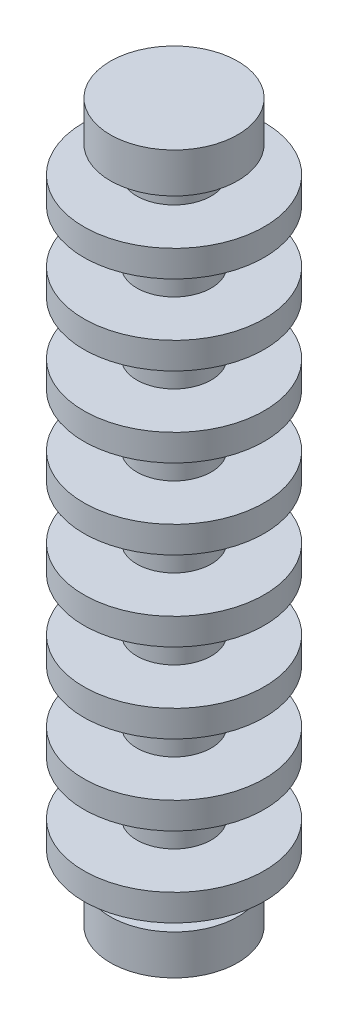
ISO-10303-21;
HEADER;
FILE_DESCRIPTION(('STEP AP214'),'2;1');
FILE_NAME('part.step','',(''),(''),'','','');
FILE_SCHEMA(('AUTOMOTIVE_DESIGN { 1 0 10303 214 1 1 1 1 }'));
ENDSEC;
DATA;
#1=APPLICATION_CONTEXT('core data for automotive mechanical design processes');
#2=APPLICATION_PROTOCOL_DEFINITION('international standard','automotive_design',2000,#1);
#3=PRODUCT_CONTEXT('',#1,'mechanical');
#4=PRODUCT('Part','Part','',(#3));
#5=PRODUCT_RELATED_PRODUCT_CATEGORY('part','',(#4));
#6=PRODUCT_DEFINITION_FORMATION('','',#4);
#7=PRODUCT_DEFINITION_CONTEXT('part definition',#1,'design');
#8=PRODUCT_DEFINITION('design','',#6,#7);
#9=PRODUCT_DEFINITION_SHAPE('','',#8);
#10=(LENGTH_UNIT() NAMED_UNIT(*) SI_UNIT(.MILLI.,.METRE.));
#11=(NAMED_UNIT(*) PLANE_ANGLE_UNIT() SI_UNIT($,.RADIAN.));
#12=(NAMED_UNIT(*) SI_UNIT($,.STERADIAN.) SOLID_ANGLE_UNIT());
#13=UNCERTAINTY_MEASURE_WITH_UNIT(LENGTH_MEASURE(1.E-05),#10,'distance_accuracy_value','');
#14=(GEOMETRIC_REPRESENTATION_CONTEXT(3) GLOBAL_UNCERTAINTY_ASSIGNED_CONTEXT((#13)) GLOBAL_UNIT_ASSIGNED_CONTEXT((#10,
#11,#12)) REPRESENTATION_CONTEXT('',''));
#15=CARTESIAN_POINT('',(0.,0.,0.));
#16=DIRECTION('',(0.,0.,1.));
#17=DIRECTION('',(1.,0.,0.));
#18=AXIS2_PLACEMENT_3D('',#15,#16,#17);
#19=CARTESIAN_POINT('',(4.79999999999947,27.,0.));
#20=DIRECTION('',(0.,-1.,0.));
#21=DIRECTION('',(1.,0.,0.));
#22=AXIS2_PLACEMENT_3D('',#19,#20,#21);
#23=PLANE('',#22);
#24=CARTESIAN_POINT('',(0.,27.,0.));
#25=DIRECTION('',(0.,1.,0.));
#26=DIRECTION('',(-1.,0.,0.));
#27=AXIS2_PLACEMENT_3D('',#24,#25,#26);
#28=CIRCLE('',#27,4.79999999999947);
#29=CARTESIAN_POINT('',(-4.79999999999947,27.,0.));
#30=VERTEX_POINT('',#29);
#31=EDGE_CURVE('E198',#30,#30,#28,.T.);
#32=ORIENTED_EDGE('',*,*,#31,.T.);
#33=EDGE_LOOP('',(#32));
#34=FACE_BOUND('',#33,.T.);
#35=ADVANCED_FACE('F43',(#34),#23,.F.);
#36=CARTESIAN_POINT('',(4.79999999999947,-27.,0.));
#37=DIRECTION('',(0.,1.,0.));
#38=DIRECTION('',(-1.,0.,0.));
#39=AXIS2_PLACEMENT_3D('',#36,#37,#38);
#40=PLANE('',#39);
#41=CARTESIAN_POINT('',(0.,-27.,0.));
#42=DIRECTION('',(0.,1.,0.));
#43=DIRECTION('',(-1.,0.,0.));
#44=AXIS2_PLACEMENT_3D('',#41,#42,#43);
#45=CIRCLE('',#44,4.79999999999947);
#46=CARTESIAN_POINT('',(-4.79999999999947,-27.,0.));
#47=VERTEX_POINT('',#46);
#48=EDGE_CURVE('E10',#47,#47,#45,.T.);
#49=ORIENTED_EDGE('',*,*,#48,.F.);
#50=EDGE_LOOP('',(#49));
#51=FACE_BOUND('',#50,.T.);
#52=ADVANCED_FACE('F421',(#51),#40,.F.);
#53=CARTESIAN_POINT('',(0.,27.,0.));
#54=DIRECTION('',(0.,1.,0.));
#55=DIRECTION('',(-1.,0.,0.));
#56=AXIS2_PLACEMENT_3D('',#53,#54,#55);
#57=CYLINDRICAL_SURFACE('',#56,4.79999999999947);
#58=CARTESIAN_POINT('',(0.,-24.,0.));
#59=DIRECTION('',(0.,1.,0.));
#60=DIRECTION('',(-1.,0.,0.));
#61=AXIS2_PLACEMENT_3D('',#58,#59,#60);
#62=CIRCLE('',#61,4.79999999999947);
#63=CARTESIAN_POINT('',(-4.79999999999947,-24.,0.));
#64=VERTEX_POINT('',#63);
#65=EDGE_CURVE('E50',#64,#64,#62,.T.);
#66=ORIENTED_EDGE('',*,*,#65,.F.);
#67=EDGE_LOOP('',(#66));
#68=FACE_BOUND('',#67,.T.);
#69=ORIENTED_EDGE('',*,*,#48,.T.);
#70=EDGE_LOOP('',(#69));
#71=FACE_BOUND('',#70,.T.);
#72=ADVANCED_FACE('F416',(#68,#71),#57,.T.);
#73=CARTESIAN_POINT('',(2.8,-24.,0.));
#74=DIRECTION('',(0.,-1.,0.));
#75=DIRECTION('',(1.,0.,0.));
#76=AXIS2_PLACEMENT_3D('',#73,#74,#75);
#77=PLANE('',#76);
#78=CARTESIAN_POINT('',(0.,-24.,0.));
#79=DIRECTION('',(0.,1.,0.));
#80=DIRECTION('',(-1.,0.,0.));
#81=AXIS2_PLACEMENT_3D('',#78,#79,#80);
#82=CIRCLE('',#81,2.8);
#83=CARTESIAN_POINT('',(-2.8,-24.,0.));
#84=VERTEX_POINT('',#83);
#85=EDGE_CURVE('E55',#84,#84,#82,.T.);
#86=ORIENTED_EDGE('',*,*,#85,.F.);
#87=EDGE_LOOP('',(#86));
#88=FACE_BOUND('',#87,.T.);
#89=ORIENTED_EDGE('',*,*,#65,.T.);
#90=EDGE_LOOP('',(#89));
#91=FACE_BOUND('',#90,.T.);
#92=ADVANCED_FACE('F411',(#88,#91),#77,.F.);
#93=CARTESIAN_POINT('',(0.,27.,0.));
#94=DIRECTION('',(0.,1.,0.));
#95=DIRECTION('',(-1.,0.,0.));
#96=AXIS2_PLACEMENT_3D('',#93,#94,#95);
#97=CYLINDRICAL_SURFACE('',#96,2.80000000000022);
#98=CARTESIAN_POINT('',(0.,-22.,0.));
#99=DIRECTION('',(0.,1.,0.));
#100=DIRECTION('',(-1.,0.,0.));
#101=AXIS2_PLACEMENT_3D('',#98,#99,#100);
#102=CIRCLE('',#101,2.80000000000043);
#103=CARTESIAN_POINT('',(-2.80000000000043,-22.,0.));
#104=VERTEX_POINT('',#103);
#105=EDGE_CURVE('E60',#104,#104,#102,.T.);
#106=ORIENTED_EDGE('',*,*,#105,.F.);
#107=EDGE_LOOP('',(#106));
#108=FACE_BOUND('',#107,.T.);
#109=ORIENTED_EDGE('',*,*,#85,.T.);
#110=EDGE_LOOP('',(#109));
#111=FACE_BOUND('',#110,.T.);
#112=ADVANCED_FACE('F405',(#108,#111),#97,.T.);
#113=CARTESIAN_POINT('',(6.80000000000044,-22.,0.));
#114=DIRECTION('',(0.,1.,0.));
#115=DIRECTION('',(-1.,0.,0.));
#116=AXIS2_PLACEMENT_3D('',#113,#114,#115);
#117=PLANE('',#116);
#118=CARTESIAN_POINT('',(0.,-22.,0.));
#119=DIRECTION('',(0.,1.,0.));
#120=DIRECTION('',(-1.,0.,0.));
#121=AXIS2_PLACEMENT_3D('',#118,#119,#120);
#122=CIRCLE('',#121,6.80000000000044);
#123=CARTESIAN_POINT('',(-6.80000000000044,-22.,0.));
#124=VERTEX_POINT('',#123);
#125=EDGE_CURVE('E66',#124,#124,#122,.T.);
#126=ORIENTED_EDGE('',*,*,#125,.F.);
#127=EDGE_LOOP('',(#126));
#128=FACE_BOUND('',#127,.T.);
#129=ORIENTED_EDGE('',*,*,#105,.T.);
#130=EDGE_LOOP('',(#129));
#131=FACE_BOUND('',#130,.T.);
#132=ADVANCED_FACE('F399',(#128,#131),#117,.F.);
#133=CARTESIAN_POINT('',(0.,27.,0.));
#134=DIRECTION('',(0.,1.,0.));
#135=DIRECTION('',(-1.,0.,0.));
#136=AXIS2_PLACEMENT_3D('',#133,#134,#135);
#137=CYLINDRICAL_SURFACE('',#136,6.80000000000044);
#138=CARTESIAN_POINT('',(0.,-20.,0.));
#139=DIRECTION('',(0.,1.,0.));
#140=DIRECTION('',(-1.,0.,0.));
#141=AXIS2_PLACEMENT_3D('',#138,#139,#140);
#142=CIRCLE('',#141,6.80000000000044);
#143=CARTESIAN_POINT('',(-6.80000000000043,-20.,0.));
#144=VERTEX_POINT('',#143);
#145=EDGE_CURVE('E70',#144,#144,#142,.T.);
#146=ORIENTED_EDGE('',*,*,#145,.F.);
#147=EDGE_LOOP('',(#146));
#148=FACE_BOUND('',#147,.T.);
#149=ORIENTED_EDGE('',*,*,#125,.T.);
#150=EDGE_LOOP('',(#149));
#151=FACE_BOUND('',#150,.T.);
#152=ADVANCED_FACE('F393',(#148,#151),#137,.T.);
#153=CARTESIAN_POINT('',(2.80000000000044,-20.,0.));
#154=DIRECTION('',(0.,-1.,0.));
#155=DIRECTION('',(1.,0.,0.));
#156=AXIS2_PLACEMENT_3D('',#153,#154,#155);
#157=PLANE('',#156);
#158=CARTESIAN_POINT('',(0.,-20.,0.));
#159=DIRECTION('',(0.,1.,0.));
#160=DIRECTION('',(-1.,0.,0.));
#161=AXIS2_PLACEMENT_3D('',#158,#159,#160);
#162=CIRCLE('',#161,2.80000000000044);
#163=CARTESIAN_POINT('',(-2.80000000000043,-20.,0.));
#164=VERTEX_POINT('',#163);
#165=EDGE_CURVE('E74',#164,#164,#162,.T.);
#166=ORIENTED_EDGE('',*,*,#165,.F.);
#167=EDGE_LOOP('',(#166));
#168=FACE_BOUND('',#167,.T.);
#169=ORIENTED_EDGE('',*,*,#145,.T.);
#170=EDGE_LOOP('',(#169));
#171=FACE_BOUND('',#170,.T.);
#172=ADVANCED_FACE('F387',(#168,#171),#157,.F.);
#173=CARTESIAN_POINT('',(0.,27.,0.));
#174=DIRECTION('',(0.,1.,0.));
#175=DIRECTION('',(-1.,0.,0.));
#176=AXIS2_PLACEMENT_3D('',#173,#174,#175);
#177=CYLINDRICAL_SURFACE('',#176,2.8000000000004);
#178=CARTESIAN_POINT('',(0.,-16.,0.));
#179=DIRECTION('',(0.,1.,0.));
#180=DIRECTION('',(-1.,0.,0.));
#181=AXIS2_PLACEMENT_3D('',#178,#179,#180);
#182=CIRCLE('',#181,2.80000000000037);
#183=CARTESIAN_POINT('',(-2.80000000000037,-16.,0.));
#184=VERTEX_POINT('',#183);
#185=EDGE_CURVE('E78',#184,#184,#182,.T.);
#186=ORIENTED_EDGE('',*,*,#185,.F.);
#187=EDGE_LOOP('',(#186));
#188=FACE_BOUND('',#187,.T.);
#189=ORIENTED_EDGE('',*,*,#165,.T.);
#190=EDGE_LOOP('',(#189));
#191=FACE_BOUND('',#190,.T.);
#192=ADVANCED_FACE('F381',(#188,#191),#177,.T.);
#193=CARTESIAN_POINT('',(6.80000000000038,-16.,0.));
#194=DIRECTION('',(0.,1.,0.));
#195=DIRECTION('',(-1.,0.,0.));
#196=AXIS2_PLACEMENT_3D('',#193,#194,#195);
#197=PLANE('',#196);
#198=CARTESIAN_POINT('',(0.,-16.,0.));
#199=DIRECTION('',(0.,1.,0.));
#200=DIRECTION('',(-1.,0.,0.));
#201=AXIS2_PLACEMENT_3D('',#198,#199,#200);
#202=CIRCLE('',#201,6.80000000000038);
#203=CARTESIAN_POINT('',(-6.80000000000037,-16.,0.));
#204=VERTEX_POINT('',#203);
#205=EDGE_CURVE('E82',#204,#204,#202,.T.);
#206=ORIENTED_EDGE('',*,*,#205,.F.);
#207=EDGE_LOOP('',(#206));
#208=FACE_BOUND('',#207,.T.);
#209=ORIENTED_EDGE('',*,*,#185,.T.);
#210=EDGE_LOOP('',(#209));
#211=FACE_BOUND('',#210,.T.);
#212=ADVANCED_FACE('F375',(#208,#211),#197,.F.);
#213=CARTESIAN_POINT('',(0.,27.,0.));
#214=DIRECTION('',(0.,1.,0.));
#215=DIRECTION('',(-1.,0.,0.));
#216=AXIS2_PLACEMENT_3D('',#213,#214,#215);
#217=CYLINDRICAL_SURFACE('',#216,6.80000000000037);
#218=CARTESIAN_POINT('',(0.,-14.,0.));
#219=DIRECTION('',(0.,1.,0.));
#220=DIRECTION('',(-1.,0.,0.));
#221=AXIS2_PLACEMENT_3D('',#218,#219,#220);
#222=CIRCLE('',#221,6.80000000000037);
#223=CARTESIAN_POINT('',(-6.80000000000037,-14.,0.));
#224=VERTEX_POINT('',#223);
#225=EDGE_CURVE('E86',#224,#224,#222,.T.);
#226=ORIENTED_EDGE('',*,*,#225,.F.);
#227=EDGE_LOOP('',(#226));
#228=FACE_BOUND('',#227,.T.);
#229=ORIENTED_EDGE('',*,*,#205,.T.);
#230=EDGE_LOOP('',(#229));
#231=FACE_BOUND('',#230,.T.);
#232=ADVANCED_FACE('F369',(#228,#231),#217,.T.);
#233=CARTESIAN_POINT('',(2.80000000000038,-14.,0.));
#234=DIRECTION('',(0.,-1.,0.));
#235=DIRECTION('',(1.,0.,0.));
#236=AXIS2_PLACEMENT_3D('',#233,#234,#235);
#237=PLANE('',#236);
#238=CARTESIAN_POINT('',(0.,-14.,0.));
#239=DIRECTION('',(0.,1.,0.));
#240=DIRECTION('',(-1.,0.,0.));
#241=AXIS2_PLACEMENT_3D('',#238,#239,#240);
#242=CIRCLE('',#241,2.80000000000037);
#243=CARTESIAN_POINT('',(-2.80000000000037,-14.,0.));
#244=VERTEX_POINT('',#243);
#245=EDGE_CURVE('E90',#244,#244,#242,.T.);
#246=ORIENTED_EDGE('',*,*,#245,.F.);
#247=EDGE_LOOP('',(#246));
#248=FACE_BOUND('',#247,.T.);
#249=ORIENTED_EDGE('',*,*,#225,.T.);
#250=EDGE_LOOP('',(#249));
#251=FACE_BOUND('',#250,.T.);
#252=ADVANCED_FACE('F363',(#248,#251),#237,.F.);
#253=CARTESIAN_POINT('',(0.,27.,0.));
#254=DIRECTION('',(0.,1.,0.));
#255=DIRECTION('',(-1.,0.,0.));
#256=AXIS2_PLACEMENT_3D('',#253,#254,#255);
#257=CYLINDRICAL_SURFACE('',#256,2.80000000000034);
#258=CARTESIAN_POINT('',(0.,-10.,0.));
#259=DIRECTION('',(0.,1.,0.));
#260=DIRECTION('',(-1.,0.,0.));
#261=AXIS2_PLACEMENT_3D('',#258,#259,#260);
#262=CIRCLE('',#261,2.80000000000031);
#263=CARTESIAN_POINT('',(-2.80000000000031,-10.,0.));
#264=VERTEX_POINT('',#263);
#265=EDGE_CURVE('E94',#264,#264,#262,.T.);
#266=ORIENTED_EDGE('',*,*,#265,.F.);
#267=EDGE_LOOP('',(#266));
#268=FACE_BOUND('',#267,.T.);
#269=ORIENTED_EDGE('',*,*,#245,.T.);
#270=EDGE_LOOP('',(#269));
#271=FACE_BOUND('',#270,.T.);
#272=ADVANCED_FACE('F357',(#268,#271),#257,.T.);
#273=CARTESIAN_POINT('',(6.80000000000032,-10.,0.));
#274=DIRECTION('',(0.,1.,0.));
#275=DIRECTION('',(-1.,0.,0.));
#276=AXIS2_PLACEMENT_3D('',#273,#274,#275);
#277=PLANE('',#276);
#278=CARTESIAN_POINT('',(0.,-10.,0.));
#279=DIRECTION('',(0.,1.,0.));
#280=DIRECTION('',(-1.,0.,0.));
#281=AXIS2_PLACEMENT_3D('',#278,#279,#280);
#282=CIRCLE('',#281,6.80000000000031);
#283=CARTESIAN_POINT('',(-6.80000000000031,-10.,0.));
#284=VERTEX_POINT('',#283);
#285=EDGE_CURVE('E98',#284,#284,#282,.T.);
#286=ORIENTED_EDGE('',*,*,#285,.F.);
#287=EDGE_LOOP('',(#286));
#288=FACE_BOUND('',#287,.T.);
#289=ORIENTED_EDGE('',*,*,#265,.T.);
#290=EDGE_LOOP('',(#289));
#291=FACE_BOUND('',#290,.T.);
#292=ADVANCED_FACE('F351',(#288,#291),#277,.F.);
#293=CARTESIAN_POINT('',(0.,27.,0.));
#294=DIRECTION('',(0.,1.,0.));
#295=DIRECTION('',(-1.,0.,0.));
#296=AXIS2_PLACEMENT_3D('',#293,#294,#295);
#297=CYLINDRICAL_SURFACE('',#296,6.80000000000031);
#298=CARTESIAN_POINT('',(0.,-8.,0.));
#299=DIRECTION('',(0.,1.,0.));
#300=DIRECTION('',(-1.,0.,0.));
#301=AXIS2_PLACEMENT_3D('',#298,#299,#300);
#302=CIRCLE('',#301,6.80000000000031);
#303=CARTESIAN_POINT('',(-6.80000000000031,-8.,0.));
#304=VERTEX_POINT('',#303);
#305=EDGE_CURVE('E102',#304,#304,#302,.T.);
#306=ORIENTED_EDGE('',*,*,#305,.F.);
#307=EDGE_LOOP('',(#306));
#308=FACE_BOUND('',#307,.T.);
#309=ORIENTED_EDGE('',*,*,#285,.T.);
#310=EDGE_LOOP('',(#309));
#311=FACE_BOUND('',#310,.T.);
#312=ADVANCED_FACE('F345',(#308,#311),#297,.T.);
#313=CARTESIAN_POINT('',(2.80000000000031,-7.99999999999999,0.));
#314=DIRECTION('',(0.,-1.,0.));
#315=DIRECTION('',(1.,0.,0.));
#316=AXIS2_PLACEMENT_3D('',#313,#314,#315);
#317=PLANE('',#316);
#318=CARTESIAN_POINT('',(0.,-8.,0.));
#319=DIRECTION('',(0.,1.,0.));
#320=DIRECTION('',(-1.,0.,0.));
#321=AXIS2_PLACEMENT_3D('',#318,#319,#320);
#322=CIRCLE('',#321,2.80000000000031);
#323=CARTESIAN_POINT('',(-2.80000000000031,-8.,0.));
#324=VERTEX_POINT('',#323);
#325=EDGE_CURVE('E106',#324,#324,#322,.T.);
#326=ORIENTED_EDGE('',*,*,#325,.F.);
#327=EDGE_LOOP('',(#326));
#328=FACE_BOUND('',#327,.T.);
#329=ORIENTED_EDGE('',*,*,#305,.T.);
#330=EDGE_LOOP('',(#329));
#331=FACE_BOUND('',#330,.T.);
#332=ADVANCED_FACE('F339',(#328,#331),#317,.F.);
#333=CARTESIAN_POINT('',(0.,27.,0.));
#334=DIRECTION('',(0.,1.,0.));
#335=DIRECTION('',(-1.,0.,0.));
#336=AXIS2_PLACEMENT_3D('',#333,#334,#335);
#337=CYLINDRICAL_SURFACE('',#336,2.80000000000028);
#338=CARTESIAN_POINT('',(0.,-4.,0.));
#339=DIRECTION('',(0.,1.,0.));
#340=DIRECTION('',(-1.,0.,0.));
#341=AXIS2_PLACEMENT_3D('',#338,#339,#340);
#342=CIRCLE('',#341,2.80000000000025);
#343=CARTESIAN_POINT('',(-2.80000000000025,-4.,0.));
#344=VERTEX_POINT('',#343);
#345=EDGE_CURVE('E110',#344,#344,#342,.T.);
#346=ORIENTED_EDGE('',*,*,#345,.F.);
#347=EDGE_LOOP('',(#346));
#348=FACE_BOUND('',#347,.T.);
#349=ORIENTED_EDGE('',*,*,#325,.T.);
#350=EDGE_LOOP('',(#349));
#351=FACE_BOUND('',#350,.T.);
#352=ADVANCED_FACE('F333',(#348,#351),#337,.T.);
#353=CARTESIAN_POINT('',(6.80000000000025,-4.,0.));
#354=DIRECTION('',(0.,1.,0.));
#355=DIRECTION('',(-1.,0.,0.));
#356=AXIS2_PLACEMENT_3D('',#353,#354,#355);
#357=PLANE('',#356);
#358=CARTESIAN_POINT('',(0.,-4.,0.));
#359=DIRECTION('',(0.,1.,0.));
#360=DIRECTION('',(-1.,0.,0.));
#361=AXIS2_PLACEMENT_3D('',#358,#359,#360);
#362=CIRCLE('',#361,6.80000000000025);
#363=CARTESIAN_POINT('',(-6.80000000000025,-4.,0.));
#364=VERTEX_POINT('',#363);
#365=EDGE_CURVE('E114',#364,#364,#362,.T.);
#366=ORIENTED_EDGE('',*,*,#365,.F.);
#367=EDGE_LOOP('',(#366));
#368=FACE_BOUND('',#367,.T.);
#369=ORIENTED_EDGE('',*,*,#345,.T.);
#370=EDGE_LOOP('',(#369));
#371=FACE_BOUND('',#370,.T.);
#372=ADVANCED_FACE('F327',(#368,#371),#357,.F.);
#373=CARTESIAN_POINT('',(0.,27.,0.));
#374=DIRECTION('',(0.,1.,0.));
#375=DIRECTION('',(-1.,0.,0.));
#376=AXIS2_PLACEMENT_3D('',#373,#374,#375);
#377=CYLINDRICAL_SURFACE('',#376,6.80000000000025);
#378=CARTESIAN_POINT('',(0.,-1.99999999999999,0.));
#379=DIRECTION('',(0.,1.,0.));
#380=DIRECTION('',(-1.,0.,0.));
#381=AXIS2_PLACEMENT_3D('',#378,#379,#380);
#382=CIRCLE('',#381,6.80000000000025);
#383=CARTESIAN_POINT('',(-6.80000000000025,-2.,0.));
#384=VERTEX_POINT('',#383);
#385=EDGE_CURVE('E118',#384,#384,#382,.T.);
#386=ORIENTED_EDGE('',*,*,#385,.F.);
#387=EDGE_LOOP('',(#386));
#388=FACE_BOUND('',#387,.T.);
#389=ORIENTED_EDGE('',*,*,#365,.T.);
#390=EDGE_LOOP('',(#389));
#391=FACE_BOUND('',#390,.T.);
#392=ADVANCED_FACE('F321',(#388,#391),#377,.T.);
#393=CARTESIAN_POINT('',(2.80000000000025,-1.99999999999999,0.));
#394=DIRECTION('',(0.,-1.,0.));
#395=DIRECTION('',(1.,0.,0.));
#396=AXIS2_PLACEMENT_3D('',#393,#394,#395);
#397=PLANE('',#396);
#398=CARTESIAN_POINT('',(0.,-1.99999999999999,0.));
#399=DIRECTION('',(0.,1.,0.));
#400=DIRECTION('',(-1.,0.,0.));
#401=AXIS2_PLACEMENT_3D('',#398,#399,#400);
#402=CIRCLE('',#401,2.80000000000025);
#403=CARTESIAN_POINT('',(-2.80000000000025,-1.99999999999999,0.));
#404=VERTEX_POINT('',#403);
#405=EDGE_CURVE('E122',#404,#404,#402,.T.);
#406=ORIENTED_EDGE('',*,*,#405,.F.);
#407=EDGE_LOOP('',(#406));
#408=FACE_BOUND('',#407,.T.);
#409=ORIENTED_EDGE('',*,*,#385,.T.);
#410=EDGE_LOOP('',(#409));
#411=FACE_BOUND('',#410,.T.);
#412=ADVANCED_FACE('F315',(#408,#411),#397,.F.);
#413=CARTESIAN_POINT('',(0.,27.,0.));
#414=DIRECTION('',(0.,1.,0.));
#415=DIRECTION('',(-1.,0.,0.));
#416=AXIS2_PLACEMENT_3D('',#413,#414,#415);
#417=CYLINDRICAL_SURFACE('',#416,2.80000000000022);
#418=CARTESIAN_POINT('',(0.,2.,0.));
#419=DIRECTION('',(0.,1.,0.));
#420=DIRECTION('',(-1.,0.,0.));
#421=AXIS2_PLACEMENT_3D('',#418,#419,#420);
#422=CIRCLE('',#421,2.80000000000019);
#423=CARTESIAN_POINT('',(-2.80000000000019,2.,0.));
#424=VERTEX_POINT('',#423);
#425=EDGE_CURVE('E126',#424,#424,#422,.T.);
#426=ORIENTED_EDGE('',*,*,#425,.F.);
#427=EDGE_LOOP('',(#426));
#428=FACE_BOUND('',#427,.T.);
#429=ORIENTED_EDGE('',*,*,#405,.T.);
#430=EDGE_LOOP('',(#429));
#431=FACE_BOUND('',#430,.T.);
#432=ADVANCED_FACE('F309',(#428,#431),#417,.T.);
#433=CARTESIAN_POINT('',(6.80000000000019,2.,0.));
#434=DIRECTION('',(0.,1.,0.));
#435=DIRECTION('',(-1.,0.,0.));
#436=AXIS2_PLACEMENT_3D('',#433,#434,#435);
#437=PLANE('',#436);
#438=CARTESIAN_POINT('',(0.,2.,0.));
#439=DIRECTION('',(0.,1.,0.));
#440=DIRECTION('',(-1.,0.,0.));
#441=AXIS2_PLACEMENT_3D('',#438,#439,#440);
#442=CIRCLE('',#441,6.80000000000019);
#443=CARTESIAN_POINT('',(-6.80000000000019,2.,0.));
#444=VERTEX_POINT('',#443);
#445=EDGE_CURVE('E130',#444,#444,#442,.T.);
#446=ORIENTED_EDGE('',*,*,#445,.F.);
#447=EDGE_LOOP('',(#446));
#448=FACE_BOUND('',#447,.T.);
#449=ORIENTED_EDGE('',*,*,#425,.T.);
#450=EDGE_LOOP('',(#449));
#451=FACE_BOUND('',#450,.T.);
#452=ADVANCED_FACE('F303',(#448,#451),#437,.F.);
#453=CARTESIAN_POINT('',(0.,27.,0.));
#454=DIRECTION('',(0.,1.,0.));
#455=DIRECTION('',(-1.,0.,0.));
#456=AXIS2_PLACEMENT_3D('',#453,#454,#455);
#457=CYLINDRICAL_SURFACE('',#456,6.80000000000019);
#458=CARTESIAN_POINT('',(0.,4.,0.));
#459=DIRECTION('',(0.,1.,0.));
#460=DIRECTION('',(-1.,0.,0.));
#461=AXIS2_PLACEMENT_3D('',#458,#459,#460);
#462=CIRCLE('',#461,6.80000000000019);
#463=CARTESIAN_POINT('',(-6.80000000000018,4.,0.));
#464=VERTEX_POINT('',#463);
#465=EDGE_CURVE('E134',#464,#464,#462,.T.);
#466=ORIENTED_EDGE('',*,*,#465,.F.);
#467=EDGE_LOOP('',(#466));
#468=FACE_BOUND('',#467,.T.);
#469=ORIENTED_EDGE('',*,*,#445,.T.);
#470=EDGE_LOOP('',(#469));
#471=FACE_BOUND('',#470,.T.);
#472=ADVANCED_FACE('F297',(#468,#471),#457,.T.);
#473=CARTESIAN_POINT('',(2.80000000000019,4.,0.));
#474=DIRECTION('',(0.,-1.,0.));
#475=DIRECTION('',(1.,0.,0.));
#476=AXIS2_PLACEMENT_3D('',#473,#474,#475);
#477=PLANE('',#476);
#478=CARTESIAN_POINT('',(0.,4.,0.));
#479=DIRECTION('',(0.,1.,0.));
#480=DIRECTION('',(-1.,0.,0.));
#481=AXIS2_PLACEMENT_3D('',#478,#479,#480);
#482=CIRCLE('',#481,2.80000000000019);
#483=CARTESIAN_POINT('',(-2.80000000000019,4.,0.));
#484=VERTEX_POINT('',#483);
#485=EDGE_CURVE('E138',#484,#484,#482,.T.);
#486=ORIENTED_EDGE('',*,*,#485,.F.);
#487=EDGE_LOOP('',(#486));
#488=FACE_BOUND('',#487,.T.);
#489=ORIENTED_EDGE('',*,*,#465,.T.);
#490=EDGE_LOOP('',(#489));
#491=FACE_BOUND('',#490,.T.);
#492=ADVANCED_FACE('F291',(#488,#491),#477,.F.);
#493=CARTESIAN_POINT('',(0.,27.,0.));
#494=DIRECTION('',(0.,1.,0.));
#495=DIRECTION('',(-1.,0.,0.));
#496=AXIS2_PLACEMENT_3D('',#493,#494,#495);
#497=CYLINDRICAL_SURFACE('',#496,2.80000000000015);
#498=CARTESIAN_POINT('',(0.,8.,0.));
#499=DIRECTION('',(0.,1.,0.));
#500=DIRECTION('',(-1.,0.,0.));
#501=AXIS2_PLACEMENT_3D('',#498,#499,#500);
#502=CIRCLE('',#501,2.80000000000012);
#503=CARTESIAN_POINT('',(-2.80000000000012,8.,0.));
#504=VERTEX_POINT('',#503);
#505=EDGE_CURVE('E142',#504,#504,#502,.T.);
#506=ORIENTED_EDGE('',*,*,#505,.F.);
#507=EDGE_LOOP('',(#506));
#508=FACE_BOUND('',#507,.T.);
#509=ORIENTED_EDGE('',*,*,#485,.T.);
#510=EDGE_LOOP('',(#509));
#511=FACE_BOUND('',#510,.T.);
#512=ADVANCED_FACE('F285',(#508,#511),#497,.T.);
#513=CARTESIAN_POINT('',(6.80000000000013,8.,0.));
#514=DIRECTION('',(0.,1.,0.));
#515=DIRECTION('',(-1.,0.,0.));
#516=AXIS2_PLACEMENT_3D('',#513,#514,#515);
#517=PLANE('',#516);
#518=CARTESIAN_POINT('',(0.,8.,0.));
#519=DIRECTION('',(0.,1.,0.));
#520=DIRECTION('',(-1.,0.,0.));
#521=AXIS2_PLACEMENT_3D('',#518,#519,#520);
#522=CIRCLE('',#521,6.80000000000013);
#523=CARTESIAN_POINT('',(-6.80000000000013,8.,0.));
#524=VERTEX_POINT('',#523);
#525=EDGE_CURVE('E146',#524,#524,#522,.T.);
#526=ORIENTED_EDGE('',*,*,#525,.F.);
#527=EDGE_LOOP('',(#526));
#528=FACE_BOUND('',#527,.T.);
#529=ORIENTED_EDGE('',*,*,#505,.T.);
#530=EDGE_LOOP('',(#529));
#531=FACE_BOUND('',#530,.T.);
#532=ADVANCED_FACE('F279',(#528,#531),#517,.F.);
#533=CARTESIAN_POINT('',(0.,27.,0.));
#534=DIRECTION('',(0.,1.,0.));
#535=DIRECTION('',(-1.,0.,0.));
#536=AXIS2_PLACEMENT_3D('',#533,#534,#535);
#537=CYLINDRICAL_SURFACE('',#536,6.80000000000013);
#538=CARTESIAN_POINT('',(0.,10.,0.));
#539=DIRECTION('',(0.,1.,0.));
#540=DIRECTION('',(-1.,0.,0.));
#541=AXIS2_PLACEMENT_3D('',#538,#539,#540);
#542=CIRCLE('',#541,6.80000000000012);
#543=CARTESIAN_POINT('',(-6.80000000000012,10.,0.));
#544=VERTEX_POINT('',#543);
#545=EDGE_CURVE('E150',#544,#544,#542,.T.);
#546=ORIENTED_EDGE('',*,*,#545,.F.);
#547=EDGE_LOOP('',(#546));
#548=FACE_BOUND('',#547,.T.);
#549=ORIENTED_EDGE('',*,*,#525,.T.);
#550=EDGE_LOOP('',(#549));
#551=FACE_BOUND('',#550,.T.);
#552=ADVANCED_FACE('F273',(#548,#551),#537,.T.);
#553=CARTESIAN_POINT('',(2.80000000000013,10.,0.));
#554=DIRECTION('',(0.,-1.,0.));
#555=DIRECTION('',(1.,0.,0.));
#556=AXIS2_PLACEMENT_3D('',#553,#554,#555);
#557=PLANE('',#556);
#558=CARTESIAN_POINT('',(0.,10.,0.));
#559=DIRECTION('',(0.,1.,0.));
#560=DIRECTION('',(-1.,0.,0.));
#561=AXIS2_PLACEMENT_3D('',#558,#559,#560);
#562=CIRCLE('',#561,2.80000000000012);
#563=CARTESIAN_POINT('',(-2.80000000000012,10.,0.));
#564=VERTEX_POINT('',#563);
#565=EDGE_CURVE('E154',#564,#564,#562,.T.);
#566=ORIENTED_EDGE('',*,*,#565,.F.);
#567=EDGE_LOOP('',(#566));
#568=FACE_BOUND('',#567,.T.);
#569=ORIENTED_EDGE('',*,*,#545,.T.);
#570=EDGE_LOOP('',(#569));
#571=FACE_BOUND('',#570,.T.);
#572=ADVANCED_FACE('F267',(#568,#571),#557,.F.);
#573=CARTESIAN_POINT('',(0.,27.,0.));
#574=DIRECTION('',(0.,1.,0.));
#575=DIRECTION('',(-1.,0.,0.));
#576=AXIS2_PLACEMENT_3D('',#573,#574,#575);
#577=CYLINDRICAL_SURFACE('',#576,2.80000000000009);
#578=CARTESIAN_POINT('',(0.,14.,0.));
#579=DIRECTION('',(0.,1.,0.));
#580=DIRECTION('',(-1.,0.,0.));
#581=AXIS2_PLACEMENT_3D('',#578,#579,#580);
#582=CIRCLE('',#581,2.80000000000006);
#583=CARTESIAN_POINT('',(-2.80000000000006,14.,0.));
#584=VERTEX_POINT('',#583);
#585=EDGE_CURVE('E158',#584,#584,#582,.T.);
#586=ORIENTED_EDGE('',*,*,#585,.F.);
#587=EDGE_LOOP('',(#586));
#588=FACE_BOUND('',#587,.T.);
#589=ORIENTED_EDGE('',*,*,#565,.T.);
#590=EDGE_LOOP('',(#589));
#591=FACE_BOUND('',#590,.T.);
#592=ADVANCED_FACE('F261',(#588,#591),#577,.T.);
#593=CARTESIAN_POINT('',(6.80000000000007,14.,0.));
#594=DIRECTION('',(0.,1.,0.));
#595=DIRECTION('',(-1.,0.,0.));
#596=AXIS2_PLACEMENT_3D('',#593,#594,#595);
#597=PLANE('',#596);
#598=CARTESIAN_POINT('',(0.,14.,0.));
#599=DIRECTION('',(0.,1.,0.));
#600=DIRECTION('',(-1.,0.,0.));
#601=AXIS2_PLACEMENT_3D('',#598,#599,#600);
#602=CIRCLE('',#601,6.80000000000006);
#603=CARTESIAN_POINT('',(-6.80000000000006,14.,0.));
#604=VERTEX_POINT('',#603);
#605=EDGE_CURVE('E162',#604,#604,#602,.T.);
#606=ORIENTED_EDGE('',*,*,#605,.F.);
#607=EDGE_LOOP('',(#606));
#608=FACE_BOUND('',#607,.T.);
#609=ORIENTED_EDGE('',*,*,#585,.T.);
#610=EDGE_LOOP('',(#609));
#611=FACE_BOUND('',#610,.T.);
#612=ADVANCED_FACE('F255',(#608,#611),#597,.F.);
#613=CARTESIAN_POINT('',(0.,27.,0.));
#614=DIRECTION('',(0.,1.,0.));
#615=DIRECTION('',(-1.,0.,0.));
#616=AXIS2_PLACEMENT_3D('',#613,#614,#615);
#617=CYLINDRICAL_SURFACE('',#616,6.80000000000006);
#618=CARTESIAN_POINT('',(0.,16.,0.));
#619=DIRECTION('',(0.,1.,0.));
#620=DIRECTION('',(-1.,0.,0.));
#621=AXIS2_PLACEMENT_3D('',#618,#619,#620);
#622=CIRCLE('',#621,6.80000000000006);
#623=CARTESIAN_POINT('',(-6.80000000000006,16.,0.));
#624=VERTEX_POINT('',#623);
#625=EDGE_CURVE('E166',#624,#624,#622,.T.);
#626=ORIENTED_EDGE('',*,*,#625,.F.);
#627=EDGE_LOOP('',(#626));
#628=FACE_BOUND('',#627,.T.);
#629=ORIENTED_EDGE('',*,*,#605,.T.);
#630=EDGE_LOOP('',(#629));
#631=FACE_BOUND('',#630,.T.);
#632=ADVANCED_FACE('F249',(#628,#631),#617,.T.);
#633=CARTESIAN_POINT('',(2.80000000000006,16.,0.));
#634=DIRECTION('',(0.,-1.,0.));
#635=DIRECTION('',(1.,0.,0.));
#636=AXIS2_PLACEMENT_3D('',#633,#634,#635);
#637=PLANE('',#636);
#638=CARTESIAN_POINT('',(0.,16.,0.));
#639=DIRECTION('',(0.,1.,0.));
#640=DIRECTION('',(-1.,0.,0.));
#641=AXIS2_PLACEMENT_3D('',#638,#639,#640);
#642=CIRCLE('',#641,2.80000000000006);
#643=CARTESIAN_POINT('',(-2.80000000000006,16.,0.));
#644=VERTEX_POINT('',#643);
#645=EDGE_CURVE('E170',#644,#644,#642,.T.);
#646=ORIENTED_EDGE('',*,*,#645,.F.);
#647=EDGE_LOOP('',(#646));
#648=FACE_BOUND('',#647,.T.);
#649=ORIENTED_EDGE('',*,*,#625,.T.);
#650=EDGE_LOOP('',(#649));
#651=FACE_BOUND('',#650,.T.);
#652=ADVANCED_FACE('F243',(#648,#651),#637,.F.);
#653=CARTESIAN_POINT('',(0.,27.,0.));
#654=DIRECTION('',(0.,1.,0.));
#655=DIRECTION('',(-1.,0.,0.));
#656=AXIS2_PLACEMENT_3D('',#653,#654,#655);
#657=CYLINDRICAL_SURFACE('',#656,2.79999999999978);
#658=CARTESIAN_POINT('',(0.,20.,0.));
#659=DIRECTION('',(0.,1.,0.));
#660=DIRECTION('',(-1.,0.,0.));
#661=AXIS2_PLACEMENT_3D('',#658,#659,#660);
#662=CIRCLE('',#661,2.8);
#663=CARTESIAN_POINT('',(-2.8,20.,0.));
#664=VERTEX_POINT('',#663);
#665=EDGE_CURVE('E174',#664,#664,#662,.T.);
#666=ORIENTED_EDGE('',*,*,#665,.F.);
#667=EDGE_LOOP('',(#666));
#668=FACE_BOUND('',#667,.T.);
#669=ORIENTED_EDGE('',*,*,#645,.T.);
#670=EDGE_LOOP('',(#669));
#671=FACE_BOUND('',#670,.T.);
#672=ADVANCED_FACE('F237',(#668,#671),#657,.T.);
#673=CARTESIAN_POINT('',(6.8,20.,0.));
#674=DIRECTION('',(0.,1.,0.));
#675=DIRECTION('',(-1.,0.,0.));
#676=AXIS2_PLACEMENT_3D('',#673,#674,#675);
#677=PLANE('',#676);
#678=CARTESIAN_POINT('',(0.,20.,0.));
#679=DIRECTION('',(0.,1.,0.));
#680=DIRECTION('',(-1.,0.,0.));
#681=AXIS2_PLACEMENT_3D('',#678,#679,#680);
#682=CIRCLE('',#681,6.8);
#683=CARTESIAN_POINT('',(-6.8,20.,0.));
#684=VERTEX_POINT('',#683);
#685=EDGE_CURVE('E178',#684,#684,#682,.T.);
#686=ORIENTED_EDGE('',*,*,#685,.F.);
#687=EDGE_LOOP('',(#686));
#688=FACE_BOUND('',#687,.T.);
#689=ORIENTED_EDGE('',*,*,#665,.T.);
#690=EDGE_LOOP('',(#689));
#691=FACE_BOUND('',#690,.T.);
#692=ADVANCED_FACE('F231',(#688,#691),#677,.F.);
#693=CARTESIAN_POINT('',(0.,27.,0.));
#694=DIRECTION('',(0.,1.,0.));
#695=DIRECTION('',(-1.,0.,0.));
#696=AXIS2_PLACEMENT_3D('',#693,#694,#695);
#697=CYLINDRICAL_SURFACE('',#696,6.8);
#698=CARTESIAN_POINT('',(0.,22.,0.));
#699=DIRECTION('',(0.,1.,0.));
#700=DIRECTION('',(-1.,0.,0.));
#701=AXIS2_PLACEMENT_3D('',#698,#699,#700);
#702=CIRCLE('',#701,6.8);
#703=CARTESIAN_POINT('',(-6.8,22.,0.));
#704=VERTEX_POINT('',#703);
#705=EDGE_CURVE('E182',#704,#704,#702,.T.);
#706=ORIENTED_EDGE('',*,*,#705,.F.);
#707=EDGE_LOOP('',(#706));
#708=FACE_BOUND('',#707,.T.);
#709=ORIENTED_EDGE('',*,*,#685,.T.);
#710=EDGE_LOOP('',(#709));
#711=FACE_BOUND('',#710,.T.);
#712=ADVANCED_FACE('F225',(#708,#711),#697,.T.);
#713=CARTESIAN_POINT('',(2.8,22.,0.));
#714=DIRECTION('',(0.,-1.,0.));
#715=DIRECTION('',(1.,0.,0.));
#716=AXIS2_PLACEMENT_3D('',#713,#714,#715);
#717=PLANE('',#716);
#718=CARTESIAN_POINT('',(0.,22.,0.));
#719=DIRECTION('',(0.,1.,0.));
#720=DIRECTION('',(-1.,0.,0.));
#721=AXIS2_PLACEMENT_3D('',#718,#719,#720);
#722=CIRCLE('',#721,2.8);
#723=CARTESIAN_POINT('',(-2.8,22.,0.));
#724=VERTEX_POINT('',#723);
#725=EDGE_CURVE('E186',#724,#724,#722,.T.);
#726=ORIENTED_EDGE('',*,*,#725,.F.);
#727=EDGE_LOOP('',(#726));
#728=FACE_BOUND('',#727,.T.);
#729=ORIENTED_EDGE('',*,*,#705,.T.);
#730=EDGE_LOOP('',(#729));
#731=FACE_BOUND('',#730,.T.);
#732=ADVANCED_FACE('F219',(#728,#731),#717,.F.);
#733=CARTESIAN_POINT('',(0.,27.,0.));
#734=DIRECTION('',(0.,1.,0.));
#735=DIRECTION('',(-1.,0.,0.));
#736=AXIS2_PLACEMENT_3D('',#733,#734,#735);
#737=CYLINDRICAL_SURFACE('',#736,2.8);
#738=CARTESIAN_POINT('',(0.,24.,0.));
#739=DIRECTION('',(0.,1.,0.));
#740=DIRECTION('',(-1.,0.,0.));
#741=AXIS2_PLACEMENT_3D('',#738,#739,#740);
#742=CIRCLE('',#741,2.8);
#743=CARTESIAN_POINT('',(-2.8,24.,0.));
#744=VERTEX_POINT('',#743);
#745=EDGE_CURVE('E190',#744,#744,#742,.T.);
#746=ORIENTED_EDGE('',*,*,#745,.F.);
#747=EDGE_LOOP('',(#746));
#748=FACE_BOUND('',#747,.T.);
#749=ORIENTED_EDGE('',*,*,#725,.T.);
#750=EDGE_LOOP('',(#749));
#751=FACE_BOUND('',#750,.T.);
#752=ADVANCED_FACE('F213',(#748,#751),#737,.T.);
#753=CARTESIAN_POINT('',(2.8,24.,0.));
#754=DIRECTION('',(0.,1.,0.));
#755=DIRECTION('',(-1.,0.,0.));
#756=AXIS2_PLACEMENT_3D('',#753,#754,#755);
#757=PLANE('',#756);
#758=CARTESIAN_POINT('',(0.,24.,0.));
#759=DIRECTION('',(0.,1.,0.));
#760=DIRECTION('',(-1.,0.,0.));
#761=AXIS2_PLACEMENT_3D('',#758,#759,#760);
#762=CIRCLE('',#761,4.79999999999947);
#763=CARTESIAN_POINT('',(-4.79999999999947,24.,0.));
#764=VERTEX_POINT('',#763);
#765=EDGE_CURVE('E194',#764,#764,#762,.T.);
#766=ORIENTED_EDGE('',*,*,#765,.F.);
#767=EDGE_LOOP('',(#766));
#768=FACE_BOUND('',#767,.T.);
#769=ORIENTED_EDGE('',*,*,#745,.T.);
#770=EDGE_LOOP('',(#769));
#771=FACE_BOUND('',#770,.T.);
#772=ADVANCED_FACE('F207',(#768,#771),#757,.F.);
#773=CARTESIAN_POINT('',(0.,27.,0.));
#774=DIRECTION('',(0.,1.,0.));
#775=DIRECTION('',(-1.,0.,0.));
#776=AXIS2_PLACEMENT_3D('',#773,#774,#775);
#777=CYLINDRICAL_SURFACE('',#776,4.79999999999947);
#778=ORIENTED_EDGE('',*,*,#31,.F.);
#779=EDGE_LOOP('',(#778));
#780=FACE_BOUND('',#779,.T.);
#781=ORIENTED_EDGE('',*,*,#765,.T.);
#782=EDGE_LOOP('',(#781));
#783=FACE_BOUND('',#782,.T.);
#784=ADVANCED_FACE('F204',(#780,#783),#777,.T.);
#785=CLOSED_SHELL('',(#35,#52,#72,#92,#112,#132,#152,#172,#192,#212,#232,#252,#272,#292,#312,
#332,#352,#372,#392,#412,#432,#452,#472,#492,#512,#532,#552,#572,#592,#612,#632,#652,#672,#692,
#712,#732,#752,#772,#784));
#786=MANIFOLD_SOLID_BREP('B2',#785);
#787=ADVANCED_BREP_SHAPE_REPRESENTATION('',(#18,#786),#14);
#788=SHAPE_DEFINITION_REPRESENTATION(#9,#787);
ENDSEC;
END-ISO-10303-21;
